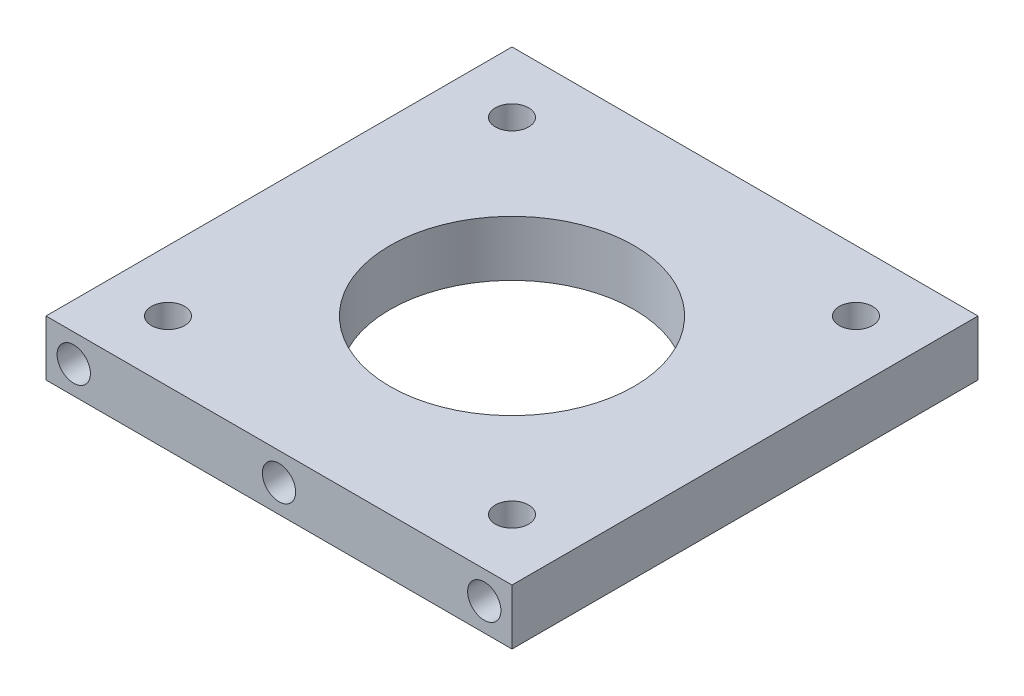
ISO-10303-21;
HEADER;
FILE_DESCRIPTION(('STEP AP214'),'2;1');
FILE_NAME('part.step','',(''),(''),'','','');
FILE_SCHEMA(('AUTOMOTIVE_DESIGN { 1 0 10303 214 1 1 1 1 }'));
ENDSEC;
DATA;
#1=APPLICATION_CONTEXT('core data for automotive mechanical design processes');
#2=APPLICATION_PROTOCOL_DEFINITION('international standard','automotive_design',2000,#1);
#3=PRODUCT_CONTEXT('',#1,'mechanical');
#4=PRODUCT('Part','Part','',(#3));
#5=PRODUCT_RELATED_PRODUCT_CATEGORY('part','',(#4));
#6=PRODUCT_DEFINITION_FORMATION('','',#4);
#7=PRODUCT_DEFINITION_CONTEXT('part definition',#1,'design');
#8=PRODUCT_DEFINITION('design','',#6,#7);
#9=PRODUCT_DEFINITION_SHAPE('','',#8);
#10=(LENGTH_UNIT() NAMED_UNIT(*) SI_UNIT(.MILLI.,.METRE.));
#11=(NAMED_UNIT(*) PLANE_ANGLE_UNIT() SI_UNIT($,.RADIAN.));
#12=(NAMED_UNIT(*) SI_UNIT($,.STERADIAN.) SOLID_ANGLE_UNIT());
#13=UNCERTAINTY_MEASURE_WITH_UNIT(LENGTH_MEASURE(1.E-05),#10,'distance_accuracy_value','');
#14=(GEOMETRIC_REPRESENTATION_CONTEXT(3) GLOBAL_UNCERTAINTY_ASSIGNED_CONTEXT((#13)) GLOBAL_UNIT_ASSIGNED_CONTEXT((#10,
#11,#12)) REPRESENTATION_CONTEXT('',''));
#15=CARTESIAN_POINT('',(0.,0.,0.));
#16=DIRECTION('',(0.,0.,1.));
#17=DIRECTION('',(1.,0.,0.));
#18=AXIS2_PLACEMENT_3D('',#15,#16,#17);
#19=CARTESIAN_POINT('',(21.,5.,21.));
#20=DIRECTION('',(-1.,0.,0.));
#21=DIRECTION('',(0.,0.,1.));
#22=AXIS2_PLACEMENT_3D('',#19,#20,#21);
#23=PLANE('',#22);
#24=DIRECTION('',(0.,0.,-1.));
#25=VECTOR('',#24,1.);
#26=CARTESIAN_POINT('',(21.,0.,21.));
#27=LINE('',#26,#25);
#28=CARTESIAN_POINT('',(21.,0.,21.));
#29=VERTEX_POINT('',#28);
#30=CARTESIAN_POINT('',(21.,0.,-21.));
#31=VERTEX_POINT('',#30);
#32=EDGE_CURVE('E98',#29,#31,#27,.T.);
#33=ORIENTED_EDGE('',*,*,#32,.T.);
#34=DIRECTION('',(0.,-1.,0.));
#35=VECTOR('',#34,1.);
#36=CARTESIAN_POINT('',(21.,5.,-21.));
#37=LINE('',#36,#35);
#38=CARTESIAN_POINT('',(21.,5.,-21.));
#39=VERTEX_POINT('',#38);
#40=EDGE_CURVE('E11',#39,#31,#37,.T.);
#41=ORIENTED_EDGE('',*,*,#40,.F.);
#42=DIRECTION('',(0.,0.,-1.));
#43=VECTOR('',#42,1.);
#44=CARTESIAN_POINT('',(21.,5.,21.));
#45=LINE('',#44,#43);
#46=CARTESIAN_POINT('',(21.,5.,21.));
#47=VERTEX_POINT('',#46);
#48=EDGE_CURVE('E86',#47,#39,#45,.T.);
#49=ORIENTED_EDGE('',*,*,#48,.F.);
#50=DIRECTION('',(0.,-1.,0.));
#51=VECTOR('',#50,1.);
#52=CARTESIAN_POINT('',(21.,5.,21.));
#53=LINE('',#52,#51);
#54=EDGE_CURVE('E94',#47,#29,#53,.T.);
#55=ORIENTED_EDGE('',*,*,#54,.T.);
#56=EDGE_LOOP('',(#33,#41,#49,#55));
#57=FACE_BOUND('',#56,.T.);
#58=ADVANCED_FACE('F35',(#57),#23,.F.);
#59=CARTESIAN_POINT('',(-21.,5.,-21.));
#60=DIRECTION('',(0.,0.,1.));
#61=DIRECTION('',(1.,0.,0.));
#62=AXIS2_PLACEMENT_3D('',#59,#60,#61);
#63=PLANE('',#62);
#64=DIRECTION('',(-1.,0.,0.));
#65=VECTOR('',#64,1.);
#66=CARTESIAN_POINT('',(-21.,0.,-21.));
#67=LINE('',#66,#65);
#68=CARTESIAN_POINT('',(-21.,0.,-21.));
#69=VERTEX_POINT('',#68);
#70=EDGE_CURVE('E90',#31,#69,#67,.T.);
#71=ORIENTED_EDGE('',*,*,#70,.T.);
#72=DIRECTION('',(0.,-1.,0.));
#73=VECTOR('',#72,1.);
#74=CARTESIAN_POINT('',(-21.,5.,-21.));
#75=LINE('',#74,#73);
#76=CARTESIAN_POINT('',(-21.,5.,-21.));
#77=VERTEX_POINT('',#76);
#78=EDGE_CURVE('E43',#77,#69,#75,.T.);
#79=ORIENTED_EDGE('',*,*,#78,.F.);
#80=DIRECTION('',(-1.,0.,0.));
#81=VECTOR('',#80,1.);
#82=CARTESIAN_POINT('',(-21.,5.,-21.));
#83=LINE('',#82,#81);
#84=EDGE_CURVE('E81',#39,#77,#83,.T.);
#85=ORIENTED_EDGE('',*,*,#84,.F.);
#86=ORIENTED_EDGE('',*,*,#40,.T.);
#87=EDGE_LOOP('',(#71,#79,#85,#86));
#88=FACE_BOUND('',#87,.T.);
#89=ADVANCED_FACE('F89',(#88),#63,.F.);
#90=CARTESIAN_POINT('',(-21.,5.,21.));
#91=DIRECTION('',(1.,0.,0.));
#92=DIRECTION('',(0.,0.,-1.));
#93=AXIS2_PLACEMENT_3D('',#90,#91,#92);
#94=PLANE('',#93);
#95=DIRECTION('',(0.,0.,1.));
#96=VECTOR('',#95,1.);
#97=CARTESIAN_POINT('',(-21.,0.,21.));
#98=LINE('',#97,#96);
#99=CARTESIAN_POINT('',(-21.,0.,21.));
#100=VERTEX_POINT('',#99);
#101=EDGE_CURVE('E68',#69,#100,#98,.T.);
#102=ORIENTED_EDGE('',*,*,#101,.T.);
#103=DIRECTION('',(0.,-1.,0.));
#104=VECTOR('',#103,1.);
#105=CARTESIAN_POINT('',(-21.,5.,21.));
#106=LINE('',#105,#104);
#107=CARTESIAN_POINT('',(-21.,5.,21.));
#108=VERTEX_POINT('',#107);
#109=EDGE_CURVE('E91',#108,#100,#106,.T.);
#110=ORIENTED_EDGE('',*,*,#109,.F.);
#111=DIRECTION('',(0.,0.,1.));
#112=VECTOR('',#111,1.);
#113=CARTESIAN_POINT('',(-21.,5.,21.));
#114=LINE('',#113,#112);
#115=EDGE_CURVE('E84',#77,#108,#114,.T.);
#116=ORIENTED_EDGE('',*,*,#115,.F.);
#117=ORIENTED_EDGE('',*,*,#78,.T.);
#118=EDGE_LOOP('',(#102,#110,#116,#117));
#119=FACE_BOUND('',#118,.T.);
#120=ADVANCED_FACE('F92',(#119),#94,.F.);
#121=CARTESIAN_POINT('',(-21.,5.,21.));
#122=DIRECTION('',(0.,0.,-1.));
#123=DIRECTION('',(-1.,0.,0.));
#124=AXIS2_PLACEMENT_3D('',#121,#122,#123);
#125=PLANE('',#124);
#126=CARTESIAN_POINT('',(0.,2.5,21.));
#127=DIRECTION('',(0.,0.,1.));
#128=DIRECTION('',(1.,0.,0.));
#129=AXIS2_PLACEMENT_3D('',#126,#127,#128);
#130=CIRCLE('',#129,1.5);
#131=CARTESIAN_POINT('',(1.50000000000001,2.5,21.));
#132=VERTEX_POINT('',#131);
#133=EDGE_CURVE('E151',#132,#132,#130,.T.);
#134=ORIENTED_EDGE('',*,*,#133,.F.);
#135=EDGE_LOOP('',(#134));
#136=FACE_BOUND('',#135,.T.);
#137=CARTESIAN_POINT('',(18.5,2.5,21.));
#138=DIRECTION('',(0.,0.,1.));
#139=DIRECTION('',(1.,0.,0.));
#140=AXIS2_PLACEMENT_3D('',#137,#138,#139);
#141=CIRCLE('',#140,1.5);
#142=CARTESIAN_POINT('',(20.,2.5,21.));
#143=VERTEX_POINT('',#142);
#144=EDGE_CURVE('E145',#143,#143,#141,.T.);
#145=ORIENTED_EDGE('',*,*,#144,.F.);
#146=EDGE_LOOP('',(#145));
#147=FACE_BOUND('',#146,.T.);
#148=CARTESIAN_POINT('',(-18.5,2.5,21.));
#149=DIRECTION('',(0.,0.,1.));
#150=DIRECTION('',(1.,0.,0.));
#151=AXIS2_PLACEMENT_3D('',#148,#149,#150);
#152=CIRCLE('',#151,1.5);
#153=CARTESIAN_POINT('',(-17.,2.5,21.));
#154=VERTEX_POINT('',#153);
#155=EDGE_CURVE('E142',#154,#154,#152,.T.);
#156=ORIENTED_EDGE('',*,*,#155,.F.);
#157=EDGE_LOOP('',(#156));
#158=FACE_BOUND('',#157,.T.);
#159=DIRECTION('',(1.,0.,0.));
#160=VECTOR('',#159,1.);
#161=CARTESIAN_POINT('',(-21.,0.,21.));
#162=LINE('',#161,#160);
#163=EDGE_CURVE('E74',#100,#29,#162,.T.);
#164=ORIENTED_EDGE('',*,*,#163,.T.);
#165=ORIENTED_EDGE('',*,*,#54,.F.);
#166=DIRECTION('',(1.,0.,0.));
#167=VECTOR('',#166,1.);
#168=CARTESIAN_POINT('',(-21.,5.,21.));
#169=LINE('',#168,#167);
#170=EDGE_CURVE('E51',#108,#47,#169,.T.);
#171=ORIENTED_EDGE('',*,*,#170,.F.);
#172=ORIENTED_EDGE('',*,*,#109,.T.);
#173=EDGE_LOOP('',(#164,#165,#171,#172));
#174=FACE_BOUND('',#173,.T.);
#175=ADVANCED_FACE('F106',(#136,#147,#158,#174),#125,.F.);
#176=CARTESIAN_POINT('',(0.,5.,0.));
#177=DIRECTION('',(0.,-1.,0.));
#178=DIRECTION('',(0.,0.,-1.));
#179=AXIS2_PLACEMENT_3D('',#176,#177,#178);
#180=PLANE('',#179);
#181=CARTESIAN_POINT('',(-15.5004387096758,5.,15.4999999968957));
#182=DIRECTION('',(0.,1.,0.));
#183=DIRECTION('',(0.,0.,1.));
#184=AXIS2_PLACEMENT_3D('',#181,#182,#183);
#185=CIRCLE('',#184,1.5);
#186=CARTESIAN_POINT('',(-15.5004387096758,5.,16.9999999968957));
#187=VERTEX_POINT('',#186);
#188=EDGE_CURVE('E136',#187,#187,#185,.T.);
#189=ORIENTED_EDGE('',*,*,#188,.F.);
#190=EDGE_LOOP('',(#189));
#191=FACE_BOUND('',#190,.T.);
#192=CARTESIAN_POINT('',(15.4995612872199,5.,15.5004387065715));
#193=DIRECTION('',(0.,1.,0.));
#194=DIRECTION('',(0.,0.,1.));
#195=AXIS2_PLACEMENT_3D('',#192,#193,#194);
#196=CIRCLE('',#195,1.5);
#197=CARTESIAN_POINT('',(15.4995612872199,5.,17.0004387065715));
#198=VERTEX_POINT('',#197);
#199=EDGE_CURVE('E130',#198,#198,#196,.T.);
#200=ORIENTED_EDGE('',*,*,#199,.F.);
#201=EDGE_LOOP('',(#200));
#202=FACE_BOUND('',#201,.T.);
#203=CARTESIAN_POINT('',(15.4999999968957,5.,-15.4995612903242));
#204=DIRECTION('',(0.,1.,0.));
#205=DIRECTION('',(0.,0.,1.));
#206=AXIS2_PLACEMENT_3D('',#203,#204,#205);
#207=CIRCLE('',#206,1.5);
#208=CARTESIAN_POINT('',(15.4999999968957,5.,-13.9995612903242));
#209=VERTEX_POINT('',#208);
#210=EDGE_CURVE('E124',#209,#209,#207,.T.);
#211=ORIENTED_EDGE('',*,*,#210,.F.);
#212=EDGE_LOOP('',(#211));
#213=FACE_BOUND('',#212,.T.);
#214=CARTESIAN_POINT('',(-15.5,5.,-15.5));
#215=DIRECTION('',(0.,1.,0.));
#216=DIRECTION('',(0.,0.,1.));
#217=AXIS2_PLACEMENT_3D('',#214,#215,#216);
#218=CIRCLE('',#217,1.5);
#219=CARTESIAN_POINT('',(-15.5,5.,-14.));
#220=VERTEX_POINT('',#219);
#221=EDGE_CURVE('E118',#220,#220,#218,.T.);
#222=ORIENTED_EDGE('',*,*,#221,.F.);
#223=EDGE_LOOP('',(#222));
#224=FACE_BOUND('',#223,.T.);
#225=CARTESIAN_POINT('',(0.,5.,0.));
#226=DIRECTION('',(0.,1.,0.));
#227=DIRECTION('',(0.,0.,1.));
#228=AXIS2_PLACEMENT_3D('',#225,#226,#227);
#229=CIRCLE('',#228,11.);
#230=CARTESIAN_POINT('',(0.,5.,11.));
#231=VERTEX_POINT('',#230);
#232=EDGE_CURVE('E112',#231,#231,#229,.T.);
#233=ORIENTED_EDGE('',*,*,#232,.F.);
#234=EDGE_LOOP('',(#233));
#235=FACE_BOUND('',#234,.T.);
#236=ORIENTED_EDGE('',*,*,#48,.T.);
#237=ORIENTED_EDGE('',*,*,#84,.T.);
#238=ORIENTED_EDGE('',*,*,#115,.T.);
#239=ORIENTED_EDGE('',*,*,#170,.T.);
#240=EDGE_LOOP('',(#236,#237,#238,#239));
#241=FACE_BOUND('',#240,.T.);
#242=ADVANCED_FACE('F82',(#191,#202,#213,#224,#235,#241),#180,.F.);
#243=CARTESIAN_POINT('',(0.,0.,0.));
#244=DIRECTION('',(0.,-1.,0.));
#245=DIRECTION('',(0.,0.,-1.));
#246=AXIS2_PLACEMENT_3D('',#243,#244,#245);
#247=PLANE('',#246);
#248=CARTESIAN_POINT('',(-15.5004387096758,0.,15.4999999968957));
#249=DIRECTION('',(0.,1.,0.));
#250=DIRECTION('',(0.,0.,1.));
#251=AXIS2_PLACEMENT_3D('',#248,#249,#250);
#252=CIRCLE('',#251,1.5);
#253=CARTESIAN_POINT('',(-15.5004387096758,0.,16.9999999968957));
#254=VERTEX_POINT('',#253);
#255=EDGE_CURVE('E133',#254,#254,#252,.T.);
#256=ORIENTED_EDGE('',*,*,#255,.T.);
#257=EDGE_LOOP('',(#256));
#258=FACE_BOUND('',#257,.T.);
#259=CARTESIAN_POINT('',(15.4995612872199,0.,15.5004387065715));
#260=DIRECTION('',(0.,1.,0.));
#261=DIRECTION('',(0.,0.,1.));
#262=AXIS2_PLACEMENT_3D('',#259,#260,#261);
#263=CIRCLE('',#262,1.5);
#264=CARTESIAN_POINT('',(15.4995612872199,0.,17.0004387065715));
#265=VERTEX_POINT('',#264);
#266=EDGE_CURVE('E127',#265,#265,#263,.T.);
#267=ORIENTED_EDGE('',*,*,#266,.T.);
#268=EDGE_LOOP('',(#267));
#269=FACE_BOUND('',#268,.T.);
#270=CARTESIAN_POINT('',(15.4999999968957,0.,-15.4995612903242));
#271=DIRECTION('',(0.,1.,0.));
#272=DIRECTION('',(0.,0.,1.));
#273=AXIS2_PLACEMENT_3D('',#270,#271,#272);
#274=CIRCLE('',#273,1.5);
#275=CARTESIAN_POINT('',(15.4999999968957,0.,-13.9995612903242));
#276=VERTEX_POINT('',#275);
#277=EDGE_CURVE('E121',#276,#276,#274,.T.);
#278=ORIENTED_EDGE('',*,*,#277,.T.);
#279=EDGE_LOOP('',(#278));
#280=FACE_BOUND('',#279,.T.);
#281=CARTESIAN_POINT('',(-15.5,0.,-15.5));
#282=DIRECTION('',(0.,1.,0.));
#283=DIRECTION('',(0.,0.,1.));
#284=AXIS2_PLACEMENT_3D('',#281,#282,#283);
#285=CIRCLE('',#284,1.5);
#286=CARTESIAN_POINT('',(-15.5,0.,-14.));
#287=VERTEX_POINT('',#286);
#288=EDGE_CURVE('E115',#287,#287,#285,.T.);
#289=ORIENTED_EDGE('',*,*,#288,.T.);
#290=EDGE_LOOP('',(#289));
#291=FACE_BOUND('',#290,.T.);
#292=CARTESIAN_POINT('',(0.,0.,0.));
#293=DIRECTION('',(0.,1.,0.));
#294=DIRECTION('',(0.,0.,1.));
#295=AXIS2_PLACEMENT_3D('',#292,#293,#294);
#296=CIRCLE('',#295,11.);
#297=CARTESIAN_POINT('',(0.,0.,11.));
#298=VERTEX_POINT('',#297);
#299=EDGE_CURVE('E101',#298,#298,#296,.T.);
#300=ORIENTED_EDGE('',*,*,#299,.T.);
#301=EDGE_LOOP('',(#300));
#302=FACE_BOUND('',#301,.T.);
#303=ORIENTED_EDGE('',*,*,#32,.F.);
#304=ORIENTED_EDGE('',*,*,#163,.F.);
#305=ORIENTED_EDGE('',*,*,#101,.F.);
#306=ORIENTED_EDGE('',*,*,#70,.F.);
#307=EDGE_LOOP('',(#303,#304,#305,#306));
#308=FACE_BOUND('',#307,.T.);
#309=ADVANCED_FACE('F109',(#258,#269,#280,#291,#302,#308),#247,.T.);
#310=CARTESIAN_POINT('',(0.,0.,0.));
#311=DIRECTION('',(0.,1.,0.));
#312=DIRECTION('',(0.,0.,1.));
#313=AXIS2_PLACEMENT_3D('',#310,#311,#312);
#314=CYLINDRICAL_SURFACE('',#313,11.);
#315=ORIENTED_EDGE('',*,*,#299,.F.);
#316=EDGE_LOOP('',(#315));
#317=FACE_BOUND('',#316,.T.);
#318=ORIENTED_EDGE('',*,*,#232,.T.);
#319=EDGE_LOOP('',(#318));
#320=FACE_BOUND('',#319,.T.);
#321=ADVANCED_FACE('F197',(#317,#320),#314,.F.);
#322=CARTESIAN_POINT('',(-15.5,0.,-15.5));
#323=DIRECTION('',(0.,1.,0.));
#324=DIRECTION('',(0.,0.,1.));
#325=AXIS2_PLACEMENT_3D('',#322,#323,#324);
#326=CYLINDRICAL_SURFACE('',#325,1.5);
#327=ORIENTED_EDGE('',*,*,#288,.F.);
#328=EDGE_LOOP('',(#327));
#329=FACE_BOUND('',#328,.T.);
#330=ORIENTED_EDGE('',*,*,#221,.T.);
#331=EDGE_LOOP('',(#330));
#332=FACE_BOUND('',#331,.T.);
#333=ADVANCED_FACE('F204',(#329,#332),#326,.F.);
#334=CARTESIAN_POINT('',(15.4999999968957,0.,-15.4995612903242));
#335=DIRECTION('',(0.,1.,0.));
#336=DIRECTION('',(0.,0.,1.));
#337=AXIS2_PLACEMENT_3D('',#334,#335,#336);
#338=CYLINDRICAL_SURFACE('',#337,1.5);
#339=ORIENTED_EDGE('',*,*,#277,.F.);
#340=EDGE_LOOP('',(#339));
#341=FACE_BOUND('',#340,.T.);
#342=ORIENTED_EDGE('',*,*,#210,.T.);
#343=EDGE_LOOP('',(#342));
#344=FACE_BOUND('',#343,.T.);
#345=ADVANCED_FACE('F208',(#341,#344),#338,.F.);
#346=CARTESIAN_POINT('',(15.4995612872199,0.,15.5004387065715));
#347=DIRECTION('',(0.,1.,0.));
#348=DIRECTION('',(0.,0.,1.));
#349=AXIS2_PLACEMENT_3D('',#346,#347,#348);
#350=CYLINDRICAL_SURFACE('',#349,1.5);
#351=ORIENTED_EDGE('',*,*,#266,.F.);
#352=EDGE_LOOP('',(#351));
#353=FACE_BOUND('',#352,.T.);
#354=ORIENTED_EDGE('',*,*,#199,.T.);
#355=EDGE_LOOP('',(#354));
#356=FACE_BOUND('',#355,.T.);
#357=ADVANCED_FACE('F182',(#353,#356),#350,.F.);
#358=CARTESIAN_POINT('',(-15.5004387096758,0.,15.4999999968957));
#359=DIRECTION('',(0.,1.,0.));
#360=DIRECTION('',(0.,0.,1.));
#361=AXIS2_PLACEMENT_3D('',#358,#359,#360);
#362=CYLINDRICAL_SURFACE('',#361,1.5);
#363=ORIENTED_EDGE('',*,*,#255,.F.);
#364=EDGE_LOOP('',(#363));
#365=FACE_BOUND('',#364,.T.);
#366=ORIENTED_EDGE('',*,*,#188,.T.);
#367=EDGE_LOOP('',(#366));
#368=FACE_BOUND('',#367,.T.);
#369=ADVANCED_FACE('F172',(#365,#368),#362,.F.);
#370=CARTESIAN_POINT('',(-18.5,2.5,17.));
#371=DIRECTION('',(0.,0.,1.));
#372=DIRECTION('',(1.,0.,0.));
#373=AXIS2_PLACEMENT_3D('',#370,#371,#372);
#374=CYLINDRICAL_SURFACE('',#373,1.5);
#375=CARTESIAN_POINT('',(-18.5,2.5,17.));
#376=DIRECTION('',(0.,0.,1.));
#377=DIRECTION('',(1.,0.,0.));
#378=AXIS2_PLACEMENT_3D('',#375,#376,#377);
#379=CIRCLE('',#378,1.5);
#380=CARTESIAN_POINT('',(-17.,2.5,17.));
#381=VERTEX_POINT('',#380);
#382=EDGE_CURVE('E139',#381,#381,#379,.T.);
#383=ORIENTED_EDGE('',*,*,#382,.F.);
#384=EDGE_LOOP('',(#383));
#385=FACE_BOUND('',#384,.T.);
#386=ORIENTED_EDGE('',*,*,#155,.T.);
#387=EDGE_LOOP('',(#386));
#388=FACE_BOUND('',#387,.T.);
#389=ADVANCED_FACE('F169',(#385,#388),#374,.F.);
#390=CARTESIAN_POINT('',(-18.5,2.5,17.));
#391=DIRECTION('',(0.,0.,1.));
#392=DIRECTION('',(1.,0.,0.));
#393=AXIS2_PLACEMENT_3D('',#390,#391,#392);
#394=PLANE('',#393);
#395=ORIENTED_EDGE('',*,*,#382,.T.);
#396=EDGE_LOOP('',(#395));
#397=FACE_BOUND('',#396,.T.);
#398=ADVANCED_FACE('F171',(#397),#394,.T.);
#399=CARTESIAN_POINT('',(18.5,2.5,17.));
#400=DIRECTION('',(0.,0.,1.));
#401=DIRECTION('',(1.,0.,0.));
#402=AXIS2_PLACEMENT_3D('',#399,#400,#401);
#403=CYLINDRICAL_SURFACE('',#402,1.5);
#404=CARTESIAN_POINT('',(18.5,2.5,17.));
#405=DIRECTION('',(0.,0.,1.));
#406=DIRECTION('',(1.,0.,0.));
#407=AXIS2_PLACEMENT_3D('',#404,#405,#406);
#408=CIRCLE('',#407,1.5);
#409=CARTESIAN_POINT('',(20.,2.5,17.));
#410=VERTEX_POINT('',#409);
#411=EDGE_CURVE('E148',#410,#410,#408,.T.);
#412=ORIENTED_EDGE('',*,*,#411,.F.);
#413=EDGE_LOOP('',(#412));
#414=FACE_BOUND('',#413,.T.);
#415=ORIENTED_EDGE('',*,*,#144,.T.);
#416=EDGE_LOOP('',(#415));
#417=FACE_BOUND('',#416,.T.);
#418=ADVANCED_FACE('F179',(#414,#417),#403,.F.);
#419=CARTESIAN_POINT('',(18.5,2.5,17.));
#420=DIRECTION('',(0.,0.,1.));
#421=DIRECTION('',(1.,0.,0.));
#422=AXIS2_PLACEMENT_3D('',#419,#420,#421);
#423=PLANE('',#422);
#424=ORIENTED_EDGE('',*,*,#411,.T.);
#425=EDGE_LOOP('',(#424));
#426=FACE_BOUND('',#425,.T.);
#427=ADVANCED_FACE('F270',(#426),#423,.T.);
#428=CARTESIAN_POINT('',(0.,2.5,17.));
#429=DIRECTION('',(0.,0.,1.));
#430=DIRECTION('',(1.,0.,0.));
#431=AXIS2_PLACEMENT_3D('',#428,#429,#430);
#432=CYLINDRICAL_SURFACE('',#431,1.5);
#433=CARTESIAN_POINT('',(0.,2.5,17.));
#434=DIRECTION('',(0.,0.,1.));
#435=DIRECTION('',(1.,0.,0.));
#436=AXIS2_PLACEMENT_3D('',#433,#434,#435);
#437=CIRCLE('',#436,1.5);
#438=CARTESIAN_POINT('',(1.50000000000001,2.5,17.));
#439=VERTEX_POINT('',#438);
#440=EDGE_CURVE('E154',#439,#439,#437,.T.);
#441=ORIENTED_EDGE('',*,*,#440,.F.);
#442=EDGE_LOOP('',(#441));
#443=FACE_BOUND('',#442,.T.);
#444=ORIENTED_EDGE('',*,*,#133,.T.);
#445=EDGE_LOOP('',(#444));
#446=FACE_BOUND('',#445,.T.);
#447=ADVANCED_FACE('F160',(#443,#446),#432,.F.);
#448=CARTESIAN_POINT('',(0.,2.5,17.));
#449=DIRECTION('',(0.,0.,1.));
#450=DIRECTION('',(1.,0.,0.));
#451=AXIS2_PLACEMENT_3D('',#448,#449,#450);
#452=PLANE('',#451);
#453=ORIENTED_EDGE('',*,*,#440,.T.);
#454=EDGE_LOOP('',(#453));
#455=FACE_BOUND('',#454,.T.);
#456=ADVANCED_FACE('F289',(#455),#452,.T.);
#457=CLOSED_SHELL('',(#58,#89,#120,#175,#242,#309,#321,#333,#345,#357,#369,#389,#398,#418,#427,
#447,#456));
#458=MANIFOLD_SOLID_BREP('B2',#457);
#459=ADVANCED_BREP_SHAPE_REPRESENTATION('',(#18,#458),#14);
#460=SHAPE_DEFINITION_REPRESENTATION(#9,#459);
ENDSEC;
END-ISO-10303-21;
